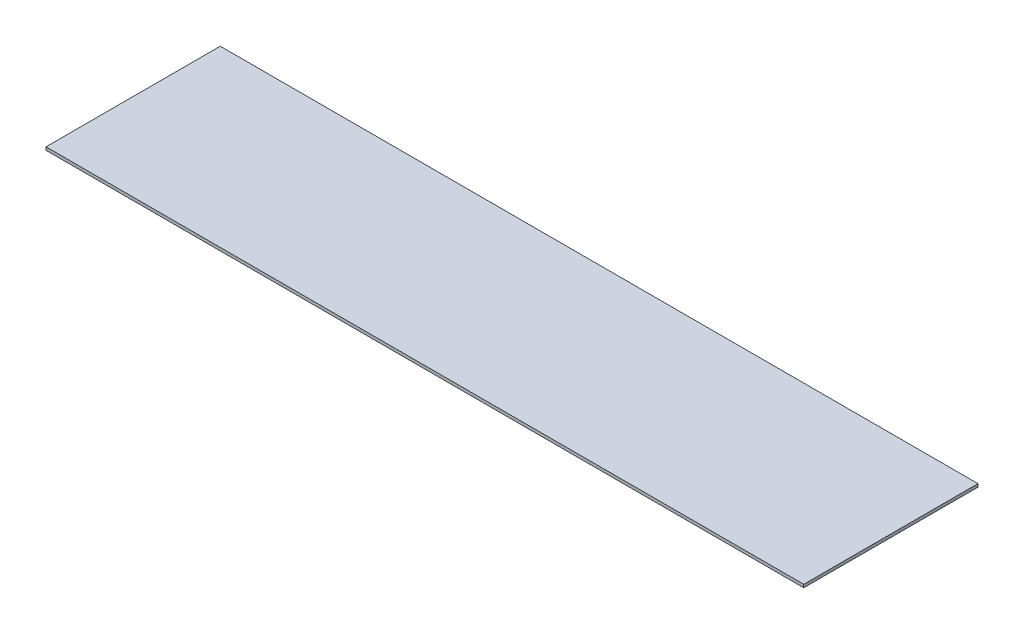
ISO-10303-21;
HEADER;
FILE_DESCRIPTION(('STEP AP214'),'2;1');
FILE_NAME('part.step','',(''),(''),'','','');
FILE_SCHEMA(('AUTOMOTIVE_DESIGN { 1 0 10303 214 1 1 1 1 }'));
ENDSEC;
DATA;
#1=APPLICATION_CONTEXT('core data for automotive mechanical design processes');
#2=APPLICATION_PROTOCOL_DEFINITION('international standard','automotive_design',2000,#1);
#3=PRODUCT_CONTEXT('',#1,'mechanical');
#4=PRODUCT('Part','Part','',(#3));
#5=PRODUCT_RELATED_PRODUCT_CATEGORY('part','',(#4));
#6=PRODUCT_DEFINITION_FORMATION('','',#4);
#7=PRODUCT_DEFINITION_CONTEXT('part definition',#1,'design');
#8=PRODUCT_DEFINITION('design','',#6,#7);
#9=PRODUCT_DEFINITION_SHAPE('','',#8);
#10=(LENGTH_UNIT() NAMED_UNIT(*) SI_UNIT(.MILLI.,.METRE.));
#11=(NAMED_UNIT(*) PLANE_ANGLE_UNIT() SI_UNIT($,.RADIAN.));
#12=(NAMED_UNIT(*) SI_UNIT($,.STERADIAN.) SOLID_ANGLE_UNIT());
#13=UNCERTAINTY_MEASURE_WITH_UNIT(LENGTH_MEASURE(1.E-05),#10,'distance_accuracy_value','');
#14=(GEOMETRIC_REPRESENTATION_CONTEXT(3) GLOBAL_UNCERTAINTY_ASSIGNED_CONTEXT((#13)) GLOBAL_UNIT_ASSIGNED_CONTEXT((#10,
#11,#12)) REPRESENTATION_CONTEXT('',''));
#15=CARTESIAN_POINT('',(0.,0.,0.));
#16=DIRECTION('',(0.,0.,1.));
#17=DIRECTION('',(1.,0.,0.));
#18=AXIS2_PLACEMENT_3D('',#15,#16,#17);
#19=CARTESIAN_POINT('',(-176.512287334594,2.,-119.092627599244));
#20=DIRECTION('',(1.,0.,0.));
#21=DIRECTION('',(0.,0.,-1.));
#22=AXIS2_PLACEMENT_3D('',#19,#20,#21);
#23=PLANE('',#22);
#24=DIRECTION('',(0.,0.,1.));
#25=VECTOR('',#24,1.);
#26=CARTESIAN_POINT('',(-176.512287334594,0.,-119.092627599244));
#27=LINE('',#26,#25);
#28=CARTESIAN_POINT('',(-176.512287334594,0.,-119.092627599244));
#29=VERTEX_POINT('',#28);
#30=CARTESIAN_POINT('',(-176.512287334594,0.,-4.09262759924385));
#31=VERTEX_POINT('',#30);
#32=EDGE_CURVE('E103',#29,#31,#27,.T.);
#33=ORIENTED_EDGE('',*,*,#32,.T.);
#34=DIRECTION('',(0.,-1.,0.));
#35=VECTOR('',#34,1.);
#36=CARTESIAN_POINT('',(-176.512287334594,2.,-4.09262759924385));
#37=LINE('',#36,#35);
#38=CARTESIAN_POINT('',(-176.512287334594,2.,-4.09262759924385));
#39=VERTEX_POINT('',#38);
#40=EDGE_CURVE('E11',#39,#31,#37,.T.);
#41=ORIENTED_EDGE('',*,*,#40,.F.);
#42=DIRECTION('',(0.,0.,1.));
#43=VECTOR('',#42,1.);
#44=CARTESIAN_POINT('',(-176.512287334594,2.,-119.092627599244));
#45=LINE('',#44,#43);
#46=CARTESIAN_POINT('',(-176.512287334594,2.,-119.092627599244));
#47=VERTEX_POINT('',#46);
#48=EDGE_CURVE('E91',#47,#39,#45,.T.);
#49=ORIENTED_EDGE('',*,*,#48,.F.);
#50=DIRECTION('',(0.,-1.,0.));
#51=VECTOR('',#50,1.);
#52=CARTESIAN_POINT('',(-176.512287334594,2.,-119.092627599244));
#53=LINE('',#52,#51);
#54=EDGE_CURVE('E99',#47,#29,#53,.T.);
#55=ORIENTED_EDGE('',*,*,#54,.T.);
#56=EDGE_LOOP('',(#33,#41,#49,#55));
#57=FACE_BOUND('',#56,.T.);
#58=ADVANCED_FACE('F40',(#57),#23,.F.);
#59=CARTESIAN_POINT('',(-176.512287334594,2.,-4.09262759924385));
#60=DIRECTION('',(0.,0.,-1.));
#61=DIRECTION('',(-1.,0.,0.));
#62=AXIS2_PLACEMENT_3D('',#59,#60,#61);
#63=PLANE('',#62);
#64=DIRECTION('',(1.,0.,0.));
#65=VECTOR('',#64,1.);
#66=CARTESIAN_POINT('',(-176.512287334594,0.,-4.09262759924385));
#67=LINE('',#66,#65);
#68=CARTESIAN_POINT('',(323.487712665406,0.,-4.09262759924385));
#69=VERTEX_POINT('',#68);
#70=EDGE_CURVE('E95',#31,#69,#67,.T.);
#71=ORIENTED_EDGE('',*,*,#70,.T.);
#72=DIRECTION('',(0.,-1.,0.));
#73=VECTOR('',#72,1.);
#74=CARTESIAN_POINT('',(323.487712665406,2.,-4.09262759924385));
#75=LINE('',#74,#73);
#76=CARTESIAN_POINT('',(323.487712665406,2.,-4.09262759924385));
#77=VERTEX_POINT('',#76);
#78=EDGE_CURVE('E48',#77,#69,#75,.T.);
#79=ORIENTED_EDGE('',*,*,#78,.F.);
#80=DIRECTION('',(1.,0.,0.));
#81=VECTOR('',#80,1.);
#82=CARTESIAN_POINT('',(-176.512287334594,2.,-4.09262759924385));
#83=LINE('',#82,#81);
#84=EDGE_CURVE('E86',#39,#77,#83,.T.);
#85=ORIENTED_EDGE('',*,*,#84,.F.);
#86=ORIENTED_EDGE('',*,*,#40,.T.);
#87=EDGE_LOOP('',(#71,#79,#85,#86));
#88=FACE_BOUND('',#87,.T.);
#89=ADVANCED_FACE('F94',(#88),#63,.F.);
#90=CARTESIAN_POINT('',(323.487712665406,2.,-119.092627599244));
#91=DIRECTION('',(-1.,0.,0.));
#92=DIRECTION('',(0.,0.,1.));
#93=AXIS2_PLACEMENT_3D('',#90,#91,#92);
#94=PLANE('',#93);
#95=DIRECTION('',(0.,0.,-1.));
#96=VECTOR('',#95,1.);
#97=CARTESIAN_POINT('',(323.487712665406,0.,-119.092627599244));
#98=LINE('',#97,#96);
#99=CARTESIAN_POINT('',(323.487712665406,0.,-119.092627599244));
#100=VERTEX_POINT('',#99);
#101=EDGE_CURVE('E73',#69,#100,#98,.T.);
#102=ORIENTED_EDGE('',*,*,#101,.T.);
#103=DIRECTION('',(0.,-1.,0.));
#104=VECTOR('',#103,1.);
#105=CARTESIAN_POINT('',(323.487712665406,2.,-119.092627599244));
#106=LINE('',#105,#104);
#107=CARTESIAN_POINT('',(323.487712665406,2.,-119.092627599244));
#108=VERTEX_POINT('',#107);
#109=EDGE_CURVE('E96',#108,#100,#106,.T.);
#110=ORIENTED_EDGE('',*,*,#109,.F.);
#111=DIRECTION('',(0.,0.,-1.));
#112=VECTOR('',#111,1.);
#113=CARTESIAN_POINT('',(323.487712665406,2.,-119.092627599244));
#114=LINE('',#113,#112);
#115=EDGE_CURVE('E89',#77,#108,#114,.T.);
#116=ORIENTED_EDGE('',*,*,#115,.F.);
#117=ORIENTED_EDGE('',*,*,#78,.T.);
#118=EDGE_LOOP('',(#102,#110,#116,#117));
#119=FACE_BOUND('',#118,.T.);
#120=ADVANCED_FACE('F97',(#119),#94,.F.);
#121=CARTESIAN_POINT('',(-176.512287334594,2.,-119.092627599244));
#122=DIRECTION('',(0.,0.,1.));
#123=DIRECTION('',(1.,0.,0.));
#124=AXIS2_PLACEMENT_3D('',#121,#122,#123);
#125=PLANE('',#124);
#126=DIRECTION('',(-1.,0.,0.));
#127=VECTOR('',#126,1.);
#128=CARTESIAN_POINT('',(-176.512287334594,0.,-119.092627599244));
#129=LINE('',#128,#127);
#130=EDGE_CURVE('E79',#100,#29,#129,.T.);
#131=ORIENTED_EDGE('',*,*,#130,.T.);
#132=ORIENTED_EDGE('',*,*,#54,.F.);
#133=DIRECTION('',(-1.,0.,0.));
#134=VECTOR('',#133,1.);
#135=CARTESIAN_POINT('',(-176.512287334594,2.,-119.092627599244));
#136=LINE('',#135,#134);
#137=EDGE_CURVE('E56',#108,#47,#136,.T.);
#138=ORIENTED_EDGE('',*,*,#137,.F.);
#139=ORIENTED_EDGE('',*,*,#109,.T.);
#140=EDGE_LOOP('',(#131,#132,#138,#139));
#141=FACE_BOUND('',#140,.T.);
#142=ADVANCED_FACE('F110',(#141),#125,.F.);
#143=CARTESIAN_POINT('',(0.,2.,0.));
#144=DIRECTION('',(0.,1.,0.));
#145=DIRECTION('',(0.,0.,1.));
#146=AXIS2_PLACEMENT_3D('',#143,#144,#145);
#147=PLANE('',#146);
#148=ORIENTED_EDGE('',*,*,#48,.T.);
#149=ORIENTED_EDGE('',*,*,#84,.T.);
#150=ORIENTED_EDGE('',*,*,#115,.T.);
#151=ORIENTED_EDGE('',*,*,#137,.T.);
#152=EDGE_LOOP('',(#148,#149,#150,#151));
#153=FACE_BOUND('',#152,.T.);
#154=ADVANCED_FACE('F87',(#153),#147,.T.);
#155=CARTESIAN_POINT('',(0.,0.,0.));
#156=DIRECTION('',(0.,1.,0.));
#157=DIRECTION('',(0.,0.,1.));
#158=AXIS2_PLACEMENT_3D('',#155,#156,#157);
#159=PLANE('',#158);
#160=ORIENTED_EDGE('',*,*,#32,.F.);
#161=ORIENTED_EDGE('',*,*,#130,.F.);
#162=ORIENTED_EDGE('',*,*,#101,.F.);
#163=ORIENTED_EDGE('',*,*,#70,.F.);
#164=EDGE_LOOP('',(#160,#161,#162,#163));
#165=FACE_BOUND('',#164,.T.);
#166=ADVANCED_FACE('F113',(#165),#159,.F.);
#167=CLOSED_SHELL('',(#58,#89,#120,#142,#154,#166));
#168=MANIFOLD_SOLID_BREP('B2',#167);
#169=ADVANCED_BREP_SHAPE_REPRESENTATION('',(#18,#168),#14);
#170=SHAPE_DEFINITION_REPRESENTATION(#9,#169);
ENDSEC;
END-ISO-10303-21;
